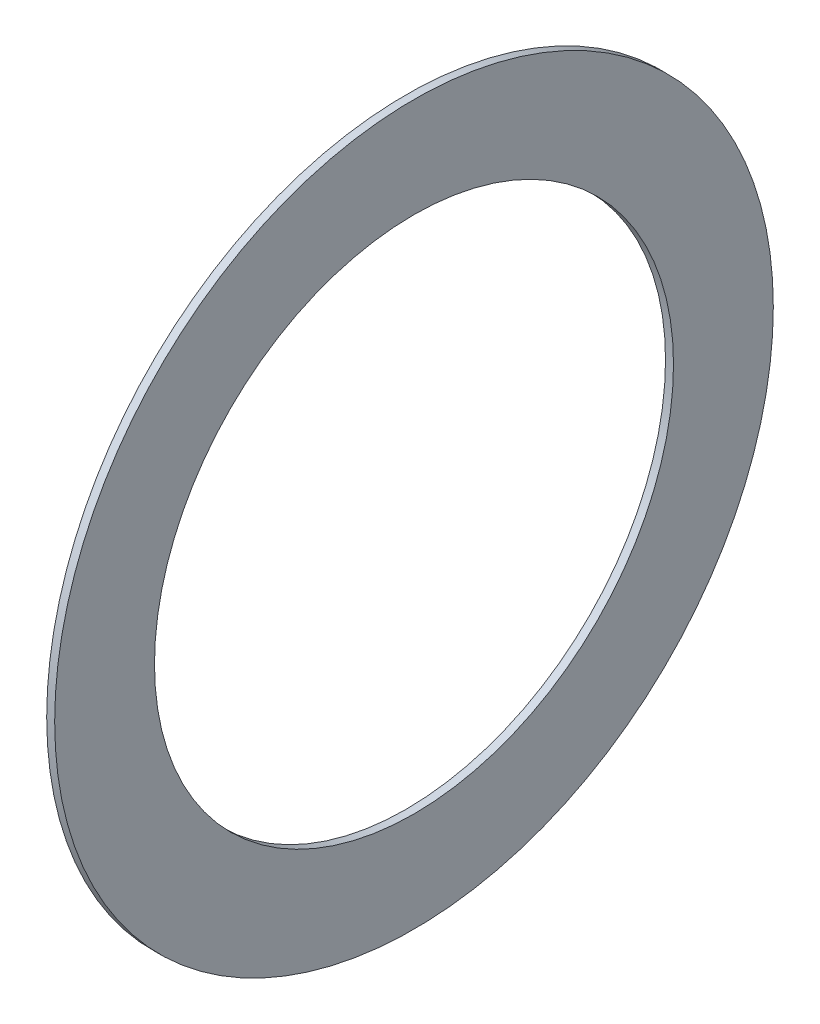
ISO-10303-21;
HEADER;
FILE_DESCRIPTION(('STEP AP214'),'2;1');
FILE_NAME('part.step','',(''),(''),'','','');
FILE_SCHEMA(('AUTOMOTIVE_DESIGN { 1 0 10303 214 1 1 1 1 }'));
ENDSEC;
DATA;
#1=APPLICATION_CONTEXT('core data for automotive mechanical design processes');
#2=APPLICATION_PROTOCOL_DEFINITION('international standard','automotive_design',2000,#1);
#3=PRODUCT_CONTEXT('',#1,'mechanical');
#4=PRODUCT('Part','Part','',(#3));
#5=PRODUCT_RELATED_PRODUCT_CATEGORY('part','',(#4));
#6=PRODUCT_DEFINITION_FORMATION('','',#4);
#7=PRODUCT_DEFINITION_CONTEXT('part definition',#1,'design');
#8=PRODUCT_DEFINITION('design','',#6,#7);
#9=PRODUCT_DEFINITION_SHAPE('','',#8);
#10=(LENGTH_UNIT() NAMED_UNIT(*) SI_UNIT(.MILLI.,.METRE.));
#11=(NAMED_UNIT(*) PLANE_ANGLE_UNIT() SI_UNIT($,.RADIAN.));
#12=(NAMED_UNIT(*) SI_UNIT($,.STERADIAN.) SOLID_ANGLE_UNIT());
#13=UNCERTAINTY_MEASURE_WITH_UNIT(LENGTH_MEASURE(1.E-05),#10,'distance_accuracy_value','');
#14=(GEOMETRIC_REPRESENTATION_CONTEXT(3) GLOBAL_UNCERTAINTY_ASSIGNED_CONTEXT((#13)) GLOBAL_UNIT_ASSIGNED_CONTEXT((#10,
#11,#12)) REPRESENTATION_CONTEXT('',''));
#15=CARTESIAN_POINT('',(0.,0.,0.));
#16=DIRECTION('',(0.,0.,1.));
#17=DIRECTION('',(1.,0.,0.));
#18=AXIS2_PLACEMENT_3D('',#15,#16,#17);
#19=CARTESIAN_POINT('',(1.5,-45.4986197943839,-45.));
#20=DIRECTION('',(-1.,0.,0.));
#21=DIRECTION('',(0.,0.,1.));
#22=AXIS2_PLACEMENT_3D('',#19,#20,#21);
#23=PLANE('',#22);
#24=CARTESIAN_POINT('',(1.5,0.,0.));
#25=DIRECTION('',(-1.,0.,0.));
#26=DIRECTION('',(0.,0.,-1.));
#27=AXIS2_PLACEMENT_3D('',#24,#25,#26);
#28=CIRCLE('',#27,45.);
#29=CARTESIAN_POINT('',(1.5,0.,-45.));
#30=VERTEX_POINT('',#29);
#31=EDGE_CURVE('E30',#30,#30,#28,.F.);
#32=ORIENTED_EDGE('',*,*,#31,.F.);
#33=EDGE_LOOP('',(#32));
#34=FACE_BOUND('',#33,.T.);
#35=CARTESIAN_POINT('',(1.5,0.,0.));
#36=DIRECTION('',(1.,0.,0.));
#37=DIRECTION('',(0.,0.,1.));
#38=AXIS2_PLACEMENT_3D('',#35,#36,#37);
#39=CIRCLE('',#38,32.5);
#40=CARTESIAN_POINT('',(1.5,0.,32.5));
#41=VERTEX_POINT('',#40);
#42=EDGE_CURVE('E26',#41,#41,#39,.T.);
#43=ORIENTED_EDGE('',*,*,#42,.T.);
#44=EDGE_LOOP('',(#43));
#45=FACE_BOUND('',#44,.T.);
#46=ADVANCED_FACE('F15',(#34,#45),#23,.T.);
#47=CARTESIAN_POINT('',(2.5,-45.4986197219598,45.));
#48=DIRECTION('',(1.,0.,0.));
#49=DIRECTION('',(0.,0.,-1.));
#50=AXIS2_PLACEMENT_3D('',#47,#48,#49);
#51=PLANE('',#50);
#52=CARTESIAN_POINT('',(2.5,0.,0.));
#53=DIRECTION('',(1.,0.,0.));
#54=DIRECTION('',(0.,-1.1684785287495E-09,1.));
#55=AXIS2_PLACEMENT_3D('',#52,#53,#54);
#56=CIRCLE('',#55,45.);
#57=CARTESIAN_POINT('',(2.5,-5.25815337937274E-08,45.));
#58=VERTEX_POINT('',#57);
#59=EDGE_CURVE('E22',#58,#58,#56,.T.);
#60=ORIENTED_EDGE('',*,*,#59,.T.);
#61=EDGE_LOOP('',(#60));
#62=FACE_BOUND('',#61,.T.);
#63=CARTESIAN_POINT('',(2.5,0.,0.));
#64=DIRECTION('',(-1.,0.,0.));
#65=DIRECTION('',(0.,0.,-1.));
#66=AXIS2_PLACEMENT_3D('',#63,#64,#65);
#67=CIRCLE('',#66,32.5);
#68=CARTESIAN_POINT('',(2.5,0.,-32.5));
#69=VERTEX_POINT('',#68);
#70=EDGE_CURVE('E10',#69,#69,#67,.F.);
#71=ORIENTED_EDGE('',*,*,#70,.F.);
#72=EDGE_LOOP('',(#71));
#73=FACE_BOUND('',#72,.T.);
#74=ADVANCED_FACE('F40',(#62,#73),#51,.T.);
#75=CARTESIAN_POINT('',(50.,0.,0.));
#76=DIRECTION('',(1.,0.,0.));
#77=DIRECTION('',(0.,0.,1.));
#78=AXIS2_PLACEMENT_3D('',#75,#76,#77);
#79=CYLINDRICAL_SURFACE('',#78,32.5);
#80=ORIENTED_EDGE('',*,*,#70,.T.);
#81=EDGE_LOOP('',(#80));
#82=FACE_BOUND('',#81,.T.);
#83=ORIENTED_EDGE('',*,*,#42,.F.);
#84=EDGE_LOOP('',(#83));
#85=FACE_BOUND('',#84,.T.);
#86=ADVANCED_FACE('F44',(#82,#85),#79,.F.);
#87=CARTESIAN_POINT('',(50.,0.,0.));
#88=DIRECTION('',(1.,0.,0.));
#89=DIRECTION('',(0.,0.,1.));
#90=AXIS2_PLACEMENT_3D('',#87,#88,#89);
#91=CYLINDRICAL_SURFACE('',#90,45.);
#92=ORIENTED_EDGE('',*,*,#31,.T.);
#93=EDGE_LOOP('',(#92));
#94=FACE_BOUND('',#93,.T.);
#95=ORIENTED_EDGE('',*,*,#59,.F.);
#96=EDGE_LOOP('',(#95));
#97=FACE_BOUND('',#96,.T.);
#98=ADVANCED_FACE('F17',(#94,#97),#91,.T.);
#99=CLOSED_SHELL('',(#46,#74,#86,#98));
#100=MANIFOLD_SOLID_BREP('B1',#99);
#101=ADVANCED_BREP_SHAPE_REPRESENTATION('',(#18,#100),#14);
#102=SHAPE_DEFINITION_REPRESENTATION(#9,#101);
ENDSEC;
END-ISO-10303-21;
